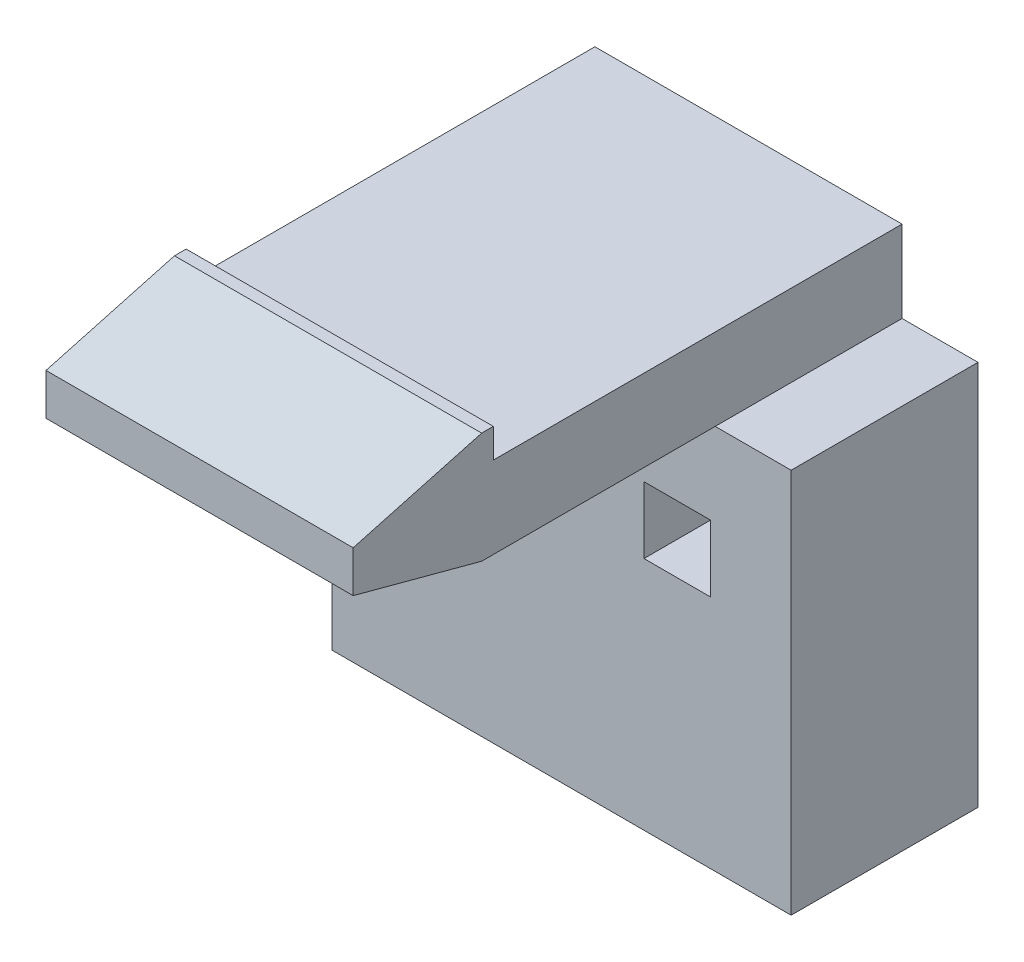
ISO-10303-21;
HEADER;
FILE_DESCRIPTION(('STEP AP214'),'2;1');
FILE_NAME('part.step','',(''),(''),'','','');
FILE_SCHEMA(('AUTOMOTIVE_DESIGN { 1 0 10303 214 1 1 1 1 }'));
ENDSEC;
DATA;
#1=APPLICATION_CONTEXT('core data for automotive mechanical design processes');
#2=APPLICATION_PROTOCOL_DEFINITION('international standard','automotive_design',2000,#1);
#3=PRODUCT_CONTEXT('',#1,'mechanical');
#4=PRODUCT('Part','Part','',(#3));
#5=PRODUCT_RELATED_PRODUCT_CATEGORY('part','',(#4));
#6=PRODUCT_DEFINITION_FORMATION('','',#4);
#7=PRODUCT_DEFINITION_CONTEXT('part definition',#1,'design');
#8=PRODUCT_DEFINITION('design','',#6,#7);
#9=PRODUCT_DEFINITION_SHAPE('','',#8);
#10=(LENGTH_UNIT() NAMED_UNIT(*) SI_UNIT(.MILLI.,.METRE.));
#11=(NAMED_UNIT(*) PLANE_ANGLE_UNIT() SI_UNIT($,.RADIAN.));
#12=(NAMED_UNIT(*) SI_UNIT($,.STERADIAN.) SOLID_ANGLE_UNIT());
#13=UNCERTAINTY_MEASURE_WITH_UNIT(LENGTH_MEASURE(1.E-05),#10,'distance_accuracy_value','');
#14=(GEOMETRIC_REPRESENTATION_CONTEXT(3) GLOBAL_UNCERTAINTY_ASSIGNED_CONTEXT((#13)) GLOBAL_UNIT_ASSIGNED_CONTEXT((#10,
#11,#12)) REPRESENTATION_CONTEXT('',''));
#15=CARTESIAN_POINT('',(0.,0.,0.));
#16=DIRECTION('',(0.,0.,1.));
#17=DIRECTION('',(1.,0.,0.));
#18=AXIS2_PLACEMENT_3D('',#15,#16,#17);
#19=CARTESIAN_POINT('',(0.,0.,9.4));
#20=DIRECTION('',(0.,0.,-1.));
#21=DIRECTION('',(-1.,0.,0.));
#22=AXIS2_PLACEMENT_3D('',#19,#20,#21);
#23=PLANE('',#22);
#24=DIRECTION('',(0.,1.,0.));
#25=VECTOR('',#24,1.);
#26=CARTESIAN_POINT('',(2.63,0.,9.4));
#27=LINE('',#26,#25);
#28=CARTESIAN_POINT('',(2.63,3.65,9.4));
#29=VERTEX_POINT('',#28);
#30=CARTESIAN_POINT('',(2.63,2.93948822334837,9.3999999999999));
#31=VERTEX_POINT('',#30);
#32=EDGE_CURVE('E157',#29,#31,#27,.F.);
#33=ORIENTED_EDGE('',*,*,#32,.F.);
#34=DIRECTION('',(1.,0.,0.));
#35=VECTOR('',#34,1.);
#36=CARTESIAN_POINT('',(0.,3.65,9.4));
#37=LINE('',#36,#35);
#38=CARTESIAN_POINT('',(-2.63,3.65,9.4));
#39=VERTEX_POINT('',#38);
#40=EDGE_CURVE('E162',#29,#39,#37,.F.);
#41=ORIENTED_EDGE('',*,*,#40,.T.);
#42=DIRECTION('',(0.,1.,0.));
#43=VECTOR('',#42,1.);
#44=CARTESIAN_POINT('',(-2.63,0.,9.4));
#45=LINE('',#44,#43);
#46=CARTESIAN_POINT('',(-2.63,2.93948822334837,9.3999999999999));
#47=VERTEX_POINT('',#46);
#48=EDGE_CURVE('E20',#47,#39,#45,.T.);
#49=ORIENTED_EDGE('',*,*,#48,.F.);
#50=DIRECTION('',(1.,0.,0.));
#51=VECTOR('',#50,1.);
#52=CARTESIAN_POINT('',(-3.93,2.9394882233495,9.3999999999996));
#53=LINE('',#52,#51);
#54=EDGE_CURVE('E165',#47,#31,#53,.T.);
#55=ORIENTED_EDGE('',*,*,#54,.T.);
#56=EDGE_LOOP('',(#33,#41,#49,#55));
#57=FACE_BOUND('',#56,.T.);
#58=ADVANCED_FACE('F17',(#57),#23,.F.);
#59=CARTESIAN_POINT('',(-3.93,4.25,9.4));
#60=DIRECTION('',(0.,-1.,0.));
#61=DIRECTION('',(0.,0.,-1.));
#62=AXIS2_PLACEMENT_3D('',#59,#60,#61);
#63=PLANE('',#62);
#64=DIRECTION('',(0.,0.,1.));
#65=VECTOR('',#64,1.);
#66=CARTESIAN_POINT('',(2.63,4.25,0.));
#67=LINE('',#66,#65);
#68=CARTESIAN_POINT('',(2.63,4.24999999999981,7.19999999999995));
#69=VERTEX_POINT('',#68);
#70=CARTESIAN_POINT('',(2.63,4.25,7.));
#71=VERTEX_POINT('',#70);
#72=EDGE_CURVE('E180',#69,#71,#67,.F.);
#73=ORIENTED_EDGE('',*,*,#72,.T.);
#74=DIRECTION('',(-1.,0.,0.));
#75=VECTOR('',#74,1.);
#76=CARTESIAN_POINT('',(0.,4.25,7.));
#77=LINE('',#76,#75);
#78=CARTESIAN_POINT('',(-2.63,4.25,7.));
#79=VERTEX_POINT('',#78);
#80=EDGE_CURVE('E206',#79,#71,#77,.F.);
#81=ORIENTED_EDGE('',*,*,#80,.F.);
#82=DIRECTION('',(0.,0.,-1.));
#83=VECTOR('',#82,1.);
#84=CARTESIAN_POINT('',(-2.63,4.25,9.4));
#85=LINE('',#84,#83);
#86=CARTESIAN_POINT('',(-2.63,4.2499999999999,7.19999999999996));
#87=VERTEX_POINT('',#86);
#88=EDGE_CURVE('E167',#87,#79,#85,.T.);
#89=ORIENTED_EDGE('',*,*,#88,.F.);
#90=DIRECTION('',(1.,0.,0.));
#91=VECTOR('',#90,1.);
#92=CARTESIAN_POINT('',(0.,4.24999999999961,7.1999999999999));
#93=LINE('',#92,#91);
#94=EDGE_CURVE('E176',#87,#69,#93,.T.);
#95=ORIENTED_EDGE('',*,*,#94,.T.);
#96=EDGE_LOOP('',(#73,#81,#89,#95));
#97=FACE_BOUND('',#96,.T.);
#98=ADVANCED_FACE('F207',(#97),#63,.F.);
#99=CARTESIAN_POINT('',(0.,3.65,9.4));
#100=DIRECTION('',(0.,-0.964763821237778,-0.26311740579194));
#101=DIRECTION('',(0.,0.26311740579194,-0.964763821237778));
#102=AXIS2_PLACEMENT_3D('',#99,#100,#101);
#103=PLANE('',#102);
#104=DIRECTION('',(0.,-0.263117405792109,0.964763821237732));
#105=VECTOR('',#104,1.);
#106=CARTESIAN_POINT('',(-2.63,4.25,7.2));
#107=LINE('',#106,#105);
#108=EDGE_CURVE('E175',#87,#39,#107,.T.);
#109=ORIENTED_EDGE('',*,*,#108,.T.);
#110=ORIENTED_EDGE('',*,*,#40,.F.);
#111=DIRECTION('',(0.,0.263117405792109,-0.964763821237732));
#112=VECTOR('',#111,1.);
#113=CARTESIAN_POINT('',(2.63,3.65,9.4));
#114=LINE('',#113,#112);
#115=EDGE_CURVE('E172',#29,#69,#114,.T.);
#116=ORIENTED_EDGE('',*,*,#115,.T.);
#117=ORIENTED_EDGE('',*,*,#94,.F.);
#118=EDGE_LOOP('',(#109,#110,#116,#117));
#119=FACE_BOUND('',#118,.T.);
#120=ADVANCED_FACE('F170',(#119),#103,.F.);
#121=CARTESIAN_POINT('',(-3.93,2.35,7.2));
#122=DIRECTION('',(0.,0.965925826288944,-0.258819045102985));
#123=DIRECTION('',(0.,0.258819045102985,0.965925826288944));
#124=AXIS2_PLACEMENT_3D('',#121,#122,#123);
#125=PLANE('',#124);
#126=DIRECTION('',(0.,-0.258819045102328,-0.96592582628912));
#127=VECTOR('',#126,1.);
#128=CARTESIAN_POINT('',(-2.63,2.939488223348,9.4));
#129=LINE('',#128,#127);
#130=CARTESIAN_POINT('',(-2.63,2.35,7.2));
#131=VERTEX_POINT('',#130);
#132=EDGE_CURVE('E218',#47,#131,#129,.T.);
#133=ORIENTED_EDGE('',*,*,#132,.T.);
#134=DIRECTION('',(1.,0.,0.));
#135=VECTOR('',#134,1.);
#136=CARTESIAN_POINT('',(-3.93,2.35,7.2));
#137=LINE('',#136,#135);
#138=CARTESIAN_POINT('',(2.63,2.35,7.2));
#139=VERTEX_POINT('',#138);
#140=EDGE_CURVE('E185',#131,#139,#137,.T.);
#141=ORIENTED_EDGE('',*,*,#140,.T.);
#142=DIRECTION('',(0.,0.258819045102328,0.96592582628912));
#143=VECTOR('',#142,1.);
#144=CARTESIAN_POINT('',(2.63,2.35,7.2));
#145=LINE('',#144,#143);
#146=EDGE_CURVE('E211',#139,#31,#145,.T.);
#147=ORIENTED_EDGE('',*,*,#146,.T.);
#148=ORIENTED_EDGE('',*,*,#54,.F.);
#149=EDGE_LOOP('',(#133,#141,#147,#148));
#150=FACE_BOUND('',#149,.T.);
#151=ADVANCED_FACE('F261',(#150),#125,.F.);
#152=CARTESIAN_POINT('',(-2.55,-0.22,0.));
#153=DIRECTION('',(0.,-1.,0.));
#154=DIRECTION('',(0.,0.,-1.));
#155=AXIS2_PLACEMENT_3D('',#152,#153,#154);
#156=PLANE('',#155);
#157=DIRECTION('',(1.,0.,0.));
#158=VECTOR('',#157,1.);
#159=CARTESIAN_POINT('',(-2.55,-0.22,0.));
#160=LINE('',#159,#158);
#161=CARTESIAN_POINT('',(-2.55,-0.22,0.));
#162=VERTEX_POINT('',#161);
#163=CARTESIAN_POINT('',(-1.41,-0.22,0.));
#164=VERTEX_POINT('',#163);
#165=EDGE_CURVE('E190',#162,#164,#160,.T.);
#166=ORIENTED_EDGE('',*,*,#165,.F.);
#167=DIRECTION('',(0.,0.,1.));
#168=VECTOR('',#167,1.);
#169=CARTESIAN_POINT('',(-2.55,-0.22,0.));
#170=LINE('',#169,#168);
#171=CARTESIAN_POINT('',(-2.55,-0.22,3.2));
#172=VERTEX_POINT('',#171);
#173=EDGE_CURVE('E274',#162,#172,#170,.T.);
#174=ORIENTED_EDGE('',*,*,#173,.T.);
#175=DIRECTION('',(1.,0.,0.));
#176=VECTOR('',#175,1.);
#177=CARTESIAN_POINT('',(-2.55,-0.22,3.2));
#178=LINE('',#177,#176);
#179=CARTESIAN_POINT('',(-1.41,-0.22,3.2));
#180=VERTEX_POINT('',#179);
#181=EDGE_CURVE('E192',#180,#172,#178,.F.);
#182=ORIENTED_EDGE('',*,*,#181,.F.);
#183=DIRECTION('',(0.,0.,-1.));
#184=VECTOR('',#183,1.);
#185=CARTESIAN_POINT('',(-1.41,-0.22,0.));
#186=LINE('',#185,#184);
#187=EDGE_CURVE('E284',#180,#164,#186,.T.);
#188=ORIENTED_EDGE('',*,*,#187,.T.);
#189=EDGE_LOOP('',(#166,#174,#182,#188));
#190=FACE_BOUND('',#189,.T.);
#191=ADVANCED_FACE('F359',(#190),#156,.F.);
#192=CARTESIAN_POINT('',(-3.93,2.35,3.2));
#193=DIRECTION('',(0.,1.,0.));
#194=DIRECTION('',(0.,0.,1.));
#195=AXIS2_PLACEMENT_3D('',#192,#193,#194);
#196=PLANE('',#195);
#197=DIRECTION('',(0.,0.,-1.));
#198=VECTOR('',#197,1.);
#199=CARTESIAN_POINT('',(-2.63,2.35,0.));
#200=LINE('',#199,#198);
#201=CARTESIAN_POINT('',(-2.63,2.35,3.2));
#202=VERTEX_POINT('',#201);
#203=EDGE_CURVE('E220',#131,#202,#200,.T.);
#204=ORIENTED_EDGE('',*,*,#203,.T.);
#205=DIRECTION('',(-1.,0.,0.));
#206=VECTOR('',#205,1.);
#207=CARTESIAN_POINT('',(0.,2.35,3.2));
#208=LINE('',#207,#206);
#209=CARTESIAN_POINT('',(2.63,2.35,3.2));
#210=VERTEX_POINT('',#209);
#211=EDGE_CURVE('E267',#202,#210,#208,.F.);
#212=ORIENTED_EDGE('',*,*,#211,.T.);
#213=DIRECTION('',(0.,0.,1.));
#214=VECTOR('',#213,1.);
#215=CARTESIAN_POINT('',(2.63,2.35,0.));
#216=LINE('',#215,#214);
#217=EDGE_CURVE('E227',#210,#139,#216,.T.);
#218=ORIENTED_EDGE('',*,*,#217,.T.);
#219=ORIENTED_EDGE('',*,*,#140,.F.);
#220=EDGE_LOOP('',(#204,#212,#218,#219));
#221=FACE_BOUND('',#220,.T.);
#222=ADVANCED_FACE('F265',(#221),#196,.F.);
#223=CARTESIAN_POINT('',(1.41,-0.22,0.));
#224=DIRECTION('',(0.,-1.,0.));
#225=DIRECTION('',(0.,0.,-1.));
#226=AXIS2_PLACEMENT_3D('',#223,#224,#225);
#227=PLANE('',#226);
#228=DIRECTION('',(1.,0.,0.));
#229=VECTOR('',#228,1.);
#230=CARTESIAN_POINT('',(1.41,-0.22,0.));
#231=LINE('',#230,#229);
#232=CARTESIAN_POINT('',(1.41,-0.22,0.));
#233=VERTEX_POINT('',#232);
#234=CARTESIAN_POINT('',(2.55,-0.22,0.));
#235=VERTEX_POINT('',#234);
#236=EDGE_CURVE('E181',#233,#235,#231,.T.);
#237=ORIENTED_EDGE('',*,*,#236,.F.);
#238=DIRECTION('',(0.,0.,1.));
#239=VECTOR('',#238,1.);
#240=CARTESIAN_POINT('',(1.41,-0.22,0.));
#241=LINE('',#240,#239);
#242=CARTESIAN_POINT('',(1.41,-0.22,3.2));
#243=VERTEX_POINT('',#242);
#244=EDGE_CURVE('E327',#233,#243,#241,.T.);
#245=ORIENTED_EDGE('',*,*,#244,.T.);
#246=DIRECTION('',(-1.,0.,0.));
#247=VECTOR('',#246,1.);
#248=CARTESIAN_POINT('',(0.,-0.22,3.2));
#249=LINE('',#248,#247);
#250=CARTESIAN_POINT('',(2.55,-0.22,3.2));
#251=VERTEX_POINT('',#250);
#252=EDGE_CURVE('E341',#243,#251,#249,.F.);
#253=ORIENTED_EDGE('',*,*,#252,.T.);
#254=DIRECTION('',(0.,0.,-1.));
#255=VECTOR('',#254,1.);
#256=CARTESIAN_POINT('',(2.55,-0.22,0.));
#257=LINE('',#256,#255);
#258=EDGE_CURVE('E335',#251,#235,#257,.T.);
#259=ORIENTED_EDGE('',*,*,#258,.T.);
#260=EDGE_LOOP('',(#237,#245,#253,#259));
#261=FACE_BOUND('',#260,.T.);
#262=ADVANCED_FACE('F551',(#261),#227,.F.);
#263=CARTESIAN_POINT('',(2.63,4.25,0.));
#264=DIRECTION('',(-1.,0.,0.));
#265=DIRECTION('',(0.,0.,1.));
#266=AXIS2_PLACEMENT_3D('',#263,#264,#265);
#267=PLANE('',#266);
#268=ORIENTED_EDGE('',*,*,#217,.F.);
#269=DIRECTION('',(0.,0.,-1.));
#270=VECTOR('',#269,1.);
#271=CARTESIAN_POINT('',(2.63,2.35,0.));
#272=LINE('',#271,#270);
#273=CARTESIAN_POINT('',(2.63,2.35,0.));
#274=VERTEX_POINT('',#273);
#275=EDGE_CURVE('E242',#210,#274,#272,.T.);
#276=ORIENTED_EDGE('',*,*,#275,.T.);
#277=DIRECTION('',(0.,1.,0.));
#278=VECTOR('',#277,1.);
#279=CARTESIAN_POINT('',(2.63,4.25,0.));
#280=LINE('',#279,#278);
#281=CARTESIAN_POINT('',(2.63,3.75,0.));
#282=VERTEX_POINT('',#281);
#283=EDGE_CURVE('E183',#282,#274,#280,.F.);
#284=ORIENTED_EDGE('',*,*,#283,.F.);
#285=DIRECTION('',(0.,0.,-1.));
#286=VECTOR('',#285,1.);
#287=CARTESIAN_POINT('',(2.63,3.75,7.));
#288=LINE('',#287,#286);
#289=CARTESIAN_POINT('',(2.63,3.75,7.));
#290=VERTEX_POINT('',#289);
#291=EDGE_CURVE('E325',#282,#290,#288,.F.);
#292=ORIENTED_EDGE('',*,*,#291,.T.);
#293=DIRECTION('',(0.,1.,0.));
#294=VECTOR('',#293,1.);
#295=CARTESIAN_POINT('',(2.63,0.,7.));
#296=LINE('',#295,#294);
#297=EDGE_CURVE('E210',#71,#290,#296,.F.);
#298=ORIENTED_EDGE('',*,*,#297,.F.);
#299=ORIENTED_EDGE('',*,*,#72,.F.);
#300=ORIENTED_EDGE('',*,*,#115,.F.);
#301=ORIENTED_EDGE('',*,*,#32,.T.);
#302=ORIENTED_EDGE('',*,*,#146,.F.);
#303=EDGE_LOOP('',(#268,#276,#284,#292,#298,#299,#300,#301,#302));
#304=FACE_BOUND('',#303,.T.);
#305=ADVANCED_FACE('F178',(#304),#267,.F.);
#306=CARTESIAN_POINT('',(0.,0.,7.));
#307=DIRECTION('',(0.,0.,-1.));
#308=DIRECTION('',(-1.,0.,0.));
#309=AXIS2_PLACEMENT_3D('',#306,#307,#308);
#310=PLANE('',#309);
#311=ORIENTED_EDGE('',*,*,#297,.T.);
#312=DIRECTION('',(1.,0.,0.));
#313=VECTOR('',#312,1.);
#314=CARTESIAN_POINT('',(2.63,3.75,7.));
#315=LINE('',#314,#313);
#316=CARTESIAN_POINT('',(-2.63,3.75,7.));
#317=VERTEX_POINT('',#316);
#318=EDGE_CURVE('E215',#290,#317,#315,.F.);
#319=ORIENTED_EDGE('',*,*,#318,.T.);
#320=DIRECTION('',(0.,1.,0.));
#321=VECTOR('',#320,1.);
#322=CARTESIAN_POINT('',(-2.63,4.25,7.));
#323=LINE('',#322,#321);
#324=EDGE_CURVE('E202',#317,#79,#323,.T.);
#325=ORIENTED_EDGE('',*,*,#324,.T.);
#326=ORIENTED_EDGE('',*,*,#80,.T.);
#327=EDGE_LOOP('',(#311,#319,#325,#326));
#328=FACE_BOUND('',#327,.T.);
#329=ADVANCED_FACE('F213',(#328),#310,.T.);
#330=CARTESIAN_POINT('',(-2.63,4.25,0.));
#331=DIRECTION('',(1.,0.,0.));
#332=DIRECTION('',(0.,0.,-1.));
#333=AXIS2_PLACEMENT_3D('',#330,#331,#332);
#334=PLANE('',#333);
#335=ORIENTED_EDGE('',*,*,#48,.T.);
#336=ORIENTED_EDGE('',*,*,#108,.F.);
#337=ORIENTED_EDGE('',*,*,#88,.T.);
#338=ORIENTED_EDGE('',*,*,#324,.F.);
#339=DIRECTION('',(0.,0.,-1.));
#340=VECTOR('',#339,1.);
#341=CARTESIAN_POINT('',(-2.63,3.75,7.));
#342=LINE('',#341,#340);
#343=CARTESIAN_POINT('',(-2.63,3.75,0.));
#344=VERTEX_POINT('',#343);
#345=EDGE_CURVE('E322',#317,#344,#342,.T.);
#346=ORIENTED_EDGE('',*,*,#345,.T.);
#347=DIRECTION('',(0.,1.,0.));
#348=VECTOR('',#347,1.);
#349=CARTESIAN_POINT('',(-2.63,4.25,0.));
#350=LINE('',#349,#348);
#351=CARTESIAN_POINT('',(-2.63,2.35,0.));
#352=VERTEX_POINT('',#351);
#353=EDGE_CURVE('E216',#352,#344,#350,.T.);
#354=ORIENTED_EDGE('',*,*,#353,.F.);
#355=DIRECTION('',(0.,0.,-1.));
#356=VECTOR('',#355,1.);
#357=CARTESIAN_POINT('',(-2.63,2.35,0.));
#358=LINE('',#357,#356);
#359=EDGE_CURVE('E251',#352,#202,#358,.F.);
#360=ORIENTED_EDGE('',*,*,#359,.T.);
#361=ORIENTED_EDGE('',*,*,#203,.F.);
#362=ORIENTED_EDGE('',*,*,#132,.F.);
#363=EDGE_LOOP('',(#335,#336,#337,#338,#346,#354,#360,#361,#362));
#364=FACE_BOUND('',#363,.T.);
#365=ADVANCED_FACE('F199',(#364),#334,.F.);
#366=CARTESIAN_POINT('',(3.93,2.35,0.));
#367=DIRECTION('',(0.,-1.,0.));
#368=DIRECTION('',(0.,0.,-1.));
#369=AXIS2_PLACEMENT_3D('',#366,#367,#368);
#370=PLANE('',#369);
#371=ORIENTED_EDGE('',*,*,#275,.F.);
#372=DIRECTION('',(-1.,0.,0.));
#373=VECTOR('',#372,1.);
#374=CARTESIAN_POINT('',(0.,2.35,3.2));
#375=LINE('',#374,#373);
#376=CARTESIAN_POINT('',(3.93,2.35,3.2));
#377=VERTEX_POINT('',#376);
#378=EDGE_CURVE('E269',#210,#377,#375,.F.);
#379=ORIENTED_EDGE('',*,*,#378,.T.);
#380=DIRECTION('',(0.,0.,1.));
#381=VECTOR('',#380,1.);
#382=CARTESIAN_POINT('',(3.93,2.35,9.4));
#383=LINE('',#382,#381);
#384=CARTESIAN_POINT('',(3.93,2.35,0.));
#385=VERTEX_POINT('',#384);
#386=EDGE_CURVE('E249',#377,#385,#383,.F.);
#387=ORIENTED_EDGE('',*,*,#386,.T.);
#388=DIRECTION('',(1.,0.,0.));
#389=VECTOR('',#388,1.);
#390=CARTESIAN_POINT('',(3.93,2.35,0.));
#391=LINE('',#390,#389);
#392=EDGE_CURVE('E236',#274,#385,#391,.T.);
#393=ORIENTED_EDGE('',*,*,#392,.F.);
#394=EDGE_LOOP('',(#371,#379,#387,#393));
#395=FACE_BOUND('',#394,.T.);
#396=ADVANCED_FACE('F247',(#395),#370,.F.);
#397=CARTESIAN_POINT('',(-3.93,2.35,0.));
#398=DIRECTION('',(0.,-1.,0.));
#399=DIRECTION('',(0.,0.,-1.));
#400=AXIS2_PLACEMENT_3D('',#397,#398,#399);
#401=PLANE('',#400);
#402=DIRECTION('',(0.,0.,-1.));
#403=VECTOR('',#402,1.);
#404=CARTESIAN_POINT('',(-3.93,2.35,9.4));
#405=LINE('',#404,#403);
#406=CARTESIAN_POINT('',(-3.93,2.35,0.));
#407=VERTEX_POINT('',#406);
#408=CARTESIAN_POINT('',(-3.93,2.35,3.2));
#409=VERTEX_POINT('',#408);
#410=EDGE_CURVE('E294',#407,#409,#405,.F.);
#411=ORIENTED_EDGE('',*,*,#410,.T.);
#412=DIRECTION('',(-1.,0.,0.));
#413=VECTOR('',#412,1.);
#414=CARTESIAN_POINT('',(0.,2.35,3.2));
#415=LINE('',#414,#413);
#416=EDGE_CURVE('E270',#409,#202,#415,.F.);
#417=ORIENTED_EDGE('',*,*,#416,.T.);
#418=ORIENTED_EDGE('',*,*,#359,.F.);
#419=DIRECTION('',(1.,0.,0.));
#420=VECTOR('',#419,1.);
#421=CARTESIAN_POINT('',(-3.93,2.35,0.));
#422=LINE('',#421,#420);
#423=EDGE_CURVE('E254',#407,#352,#422,.T.);
#424=ORIENTED_EDGE('',*,*,#423,.F.);
#425=EDGE_LOOP('',(#411,#417,#418,#424));
#426=FACE_BOUND('',#425,.T.);
#427=ADVANCED_FACE('F293',(#426),#401,.F.);
#428=CARTESIAN_POINT('',(-1.41,-0.22,0.));
#429=DIRECTION('',(1.,0.,0.));
#430=DIRECTION('',(0.,0.,-1.));
#431=AXIS2_PLACEMENT_3D('',#428,#429,#430);
#432=PLANE('',#431);
#433=DIRECTION('',(0.,1.,0.));
#434=VECTOR('',#433,1.);
#435=CARTESIAN_POINT('',(-1.41,-0.22,0.));
#436=LINE('',#435,#434);
#437=CARTESIAN_POINT('',(-1.41,0.92,0.));
#438=VERTEX_POINT('',#437);
#439=EDGE_CURVE('E282',#164,#438,#436,.T.);
#440=ORIENTED_EDGE('',*,*,#439,.F.);
#441=ORIENTED_EDGE('',*,*,#187,.F.);
#442=DIRECTION('',(0.,1.,0.));
#443=VECTOR('',#442,1.);
#444=CARTESIAN_POINT('',(-1.41,0.,3.2));
#445=LINE('',#444,#443);
#446=CARTESIAN_POINT('',(-1.41,0.92,3.2));
#447=VERTEX_POINT('',#446);
#448=EDGE_CURVE('E343',#180,#447,#445,.T.);
#449=ORIENTED_EDGE('',*,*,#448,.T.);
#450=DIRECTION('',(0.,0.,1.));
#451=VECTOR('',#450,1.);
#452=CARTESIAN_POINT('',(-1.41,0.92,0.));
#453=LINE('',#452,#451);
#454=EDGE_CURVE('E368',#447,#438,#453,.F.);
#455=ORIENTED_EDGE('',*,*,#454,.T.);
#456=EDGE_LOOP('',(#440,#441,#449,#455));
#457=FACE_BOUND('',#456,.T.);
#458=ADVANCED_FACE('F501',(#457),#432,.F.);
#459=CARTESIAN_POINT('',(-2.55,-0.22,0.));
#460=DIRECTION('',(-1.,0.,0.));
#461=DIRECTION('',(0.,0.,1.));
#462=AXIS2_PLACEMENT_3D('',#459,#460,#461);
#463=PLANE('',#462);
#464=DIRECTION('',(0.,1.,0.));
#465=VECTOR('',#464,1.);
#466=CARTESIAN_POINT('',(-2.55,-0.22,0.));
#467=LINE('',#466,#465);
#468=CARTESIAN_POINT('',(-2.55,0.92,0.));
#469=VERTEX_POINT('',#468);
#470=EDGE_CURVE('E280',#469,#162,#467,.F.);
#471=ORIENTED_EDGE('',*,*,#470,.F.);
#472=DIRECTION('',(0.,0.,1.));
#473=VECTOR('',#472,1.);
#474=CARTESIAN_POINT('',(-2.55,0.92,0.));
#475=LINE('',#474,#473);
#476=CARTESIAN_POINT('',(-2.55,0.92,3.2));
#477=VERTEX_POINT('',#476);
#478=EDGE_CURVE('E350',#469,#477,#475,.T.);
#479=ORIENTED_EDGE('',*,*,#478,.T.);
#480=DIRECTION('',(0.,1.,0.));
#481=VECTOR('',#480,1.);
#482=CARTESIAN_POINT('',(-2.55,0.,3.2));
#483=LINE('',#482,#481);
#484=EDGE_CURVE('E272',#477,#172,#483,.F.);
#485=ORIENTED_EDGE('',*,*,#484,.T.);
#486=ORIENTED_EDGE('',*,*,#173,.F.);
#487=EDGE_LOOP('',(#471,#479,#485,#486));
#488=FACE_BOUND('',#487,.T.);
#489=ADVANCED_FACE('F348',(#488),#463,.F.);
#490=CARTESIAN_POINT('',(0.,0.,3.2));
#491=DIRECTION('',(0.,0.,-1.));
#492=DIRECTION('',(-1.,0.,0.));
#493=AXIS2_PLACEMENT_3D('',#490,#491,#492);
#494=PLANE('',#493);
#495=ORIENTED_EDGE('',*,*,#252,.F.);
#496=DIRECTION('',(0.,1.,0.));
#497=VECTOR('',#496,1.);
#498=CARTESIAN_POINT('',(1.41,-0.22,3.2));
#499=LINE('',#498,#497);
#500=CARTESIAN_POINT('',(1.41,0.92,3.2));
#501=VERTEX_POINT('',#500);
#502=EDGE_CURVE('E332',#243,#501,#499,.T.);
#503=ORIENTED_EDGE('',*,*,#502,.T.);
#504=DIRECTION('',(1.,0.,0.));
#505=VECTOR('',#504,1.);
#506=CARTESIAN_POINT('',(1.41,0.92,3.2));
#507=LINE('',#506,#505);
#508=CARTESIAN_POINT('',(2.55,0.92,3.2));
#509=VERTEX_POINT('',#508);
#510=EDGE_CURVE('E367',#501,#509,#507,.T.);
#511=ORIENTED_EDGE('',*,*,#510,.T.);
#512=DIRECTION('',(0.,1.,0.));
#513=VECTOR('',#512,1.);
#514=CARTESIAN_POINT('',(2.55,-0.22,3.2));
#515=LINE('',#514,#513);
#516=EDGE_CURVE('E338',#509,#251,#515,.F.);
#517=ORIENTED_EDGE('',*,*,#516,.T.);
#518=EDGE_LOOP('',(#495,#503,#511,#517));
#519=FACE_BOUND('',#518,.T.);
#520=ORIENTED_EDGE('',*,*,#181,.T.);
#521=ORIENTED_EDGE('',*,*,#484,.F.);
#522=DIRECTION('',(1.,0.,0.));
#523=VECTOR('',#522,1.);
#524=CARTESIAN_POINT('',(-2.55,0.92,3.2));
#525=LINE('',#524,#523);
#526=EDGE_CURVE('E314',#477,#447,#525,.T.);
#527=ORIENTED_EDGE('',*,*,#526,.T.);
#528=ORIENTED_EDGE('',*,*,#448,.F.);
#529=EDGE_LOOP('',(#520,#521,#527,#528));
#530=FACE_BOUND('',#529,.T.);
#531=DIRECTION('',(0.,1.,0.));
#532=VECTOR('',#531,1.);
#533=CARTESIAN_POINT('',(3.93,-4.25,3.2));
#534=LINE('',#533,#532);
#535=CARTESIAN_POINT('',(3.93,-4.25,3.2));
#536=VERTEX_POINT('',#535);
#537=EDGE_CURVE('E320',#536,#377,#534,.T.);
#538=ORIENTED_EDGE('',*,*,#537,.T.);
#539=ORIENTED_EDGE('',*,*,#378,.F.);
#540=ORIENTED_EDGE('',*,*,#211,.F.);
#541=ORIENTED_EDGE('',*,*,#416,.F.);
#542=DIRECTION('',(0.,1.,0.));
#543=VECTOR('',#542,1.);
#544=CARTESIAN_POINT('',(-3.93,-4.25,3.2));
#545=LINE('',#544,#543);
#546=CARTESIAN_POINT('',(-3.93,-4.25,3.2));
#547=VERTEX_POINT('',#546);
#548=EDGE_CURVE('E299',#409,#547,#545,.F.);
#549=ORIENTED_EDGE('',*,*,#548,.T.);
#550=DIRECTION('',(1.,0.,0.));
#551=VECTOR('',#550,1.);
#552=CARTESIAN_POINT('',(-3.93,-4.25,3.2));
#553=LINE('',#552,#551);
#554=EDGE_CURVE('E301',#547,#536,#553,.T.);
#555=ORIENTED_EDGE('',*,*,#554,.T.);
#556=EDGE_LOOP('',(#538,#539,#540,#541,#549,#555));
#557=FACE_BOUND('',#556,.T.);
#558=ADVANCED_FACE('F297',(#519,#530,#557),#494,.F.);
#559=CARTESIAN_POINT('',(2.55,-0.22,0.));
#560=DIRECTION('',(1.,0.,0.));
#561=DIRECTION('',(0.,0.,-1.));
#562=AXIS2_PLACEMENT_3D('',#559,#560,#561);
#563=PLANE('',#562);
#564=DIRECTION('',(0.,1.,0.));
#565=VECTOR('',#564,1.);
#566=CARTESIAN_POINT('',(2.55,-0.22,0.));
#567=LINE('',#566,#565);
#568=CARTESIAN_POINT('',(2.55,0.92,0.));
#569=VERTEX_POINT('',#568);
#570=EDGE_CURVE('E34',#235,#569,#567,.T.);
#571=ORIENTED_EDGE('',*,*,#570,.F.);
#572=ORIENTED_EDGE('',*,*,#258,.F.);
#573=ORIENTED_EDGE('',*,*,#516,.F.);
#574=DIRECTION('',(0.,0.,1.));
#575=VECTOR('',#574,1.);
#576=CARTESIAN_POINT('',(2.55,0.92,0.));
#577=LINE('',#576,#575);
#578=EDGE_CURVE('E370',#509,#569,#577,.F.);
#579=ORIENTED_EDGE('',*,*,#578,.T.);
#580=EDGE_LOOP('',(#571,#572,#573,#579));
#581=FACE_BOUND('',#580,.T.);
#582=ADVANCED_FACE('F473',(#581),#563,.F.);
#583=CARTESIAN_POINT('',(1.41,-0.22,0.));
#584=DIRECTION('',(-1.,0.,0.));
#585=DIRECTION('',(0.,0.,1.));
#586=AXIS2_PLACEMENT_3D('',#583,#584,#585);
#587=PLANE('',#586);
#588=DIRECTION('',(0.,1.,0.));
#589=VECTOR('',#588,1.);
#590=CARTESIAN_POINT('',(1.41,-0.22,0.));
#591=LINE('',#590,#589);
#592=CARTESIAN_POINT('',(1.41,0.92,0.));
#593=VERTEX_POINT('',#592);
#594=EDGE_CURVE('E330',#593,#233,#591,.F.);
#595=ORIENTED_EDGE('',*,*,#594,.F.);
#596=DIRECTION('',(0.,0.,1.));
#597=VECTOR('',#596,1.);
#598=CARTESIAN_POINT('',(1.41,0.92,0.));
#599=LINE('',#598,#597);
#600=EDGE_CURVE('E375',#593,#501,#599,.T.);
#601=ORIENTED_EDGE('',*,*,#600,.T.);
#602=ORIENTED_EDGE('',*,*,#502,.F.);
#603=ORIENTED_EDGE('',*,*,#244,.F.);
#604=EDGE_LOOP('',(#595,#601,#602,#603));
#605=FACE_BOUND('',#604,.T.);
#606=ADVANCED_FACE('F395',(#605),#587,.F.);
#607=CARTESIAN_POINT('',(2.63,3.75,7.));
#608=DIRECTION('',(0.,-1.,0.));
#609=DIRECTION('',(0.,0.,-1.));
#610=AXIS2_PLACEMENT_3D('',#607,#608,#609);
#611=PLANE('',#610);
#612=ORIENTED_EDGE('',*,*,#318,.F.);
#613=ORIENTED_EDGE('',*,*,#291,.F.);
#614=DIRECTION('',(-1.,0.,0.));
#615=VECTOR('',#614,1.);
#616=CARTESIAN_POINT('',(0.,3.75,0.));
#617=LINE('',#616,#615);
#618=EDGE_CURVE('E239',#344,#282,#617,.F.);
#619=ORIENTED_EDGE('',*,*,#618,.F.);
#620=ORIENTED_EDGE('',*,*,#345,.F.);
#621=EDGE_LOOP('',(#612,#613,#619,#620));
#622=FACE_BOUND('',#621,.T.);
#623=ADVANCED_FACE('F387',(#622),#611,.F.);
#624=CARTESIAN_POINT('',(3.93,-4.25,9.4));
#625=DIRECTION('',(-1.,0.,0.));
#626=DIRECTION('',(0.,0.,1.));
#627=AXIS2_PLACEMENT_3D('',#624,#625,#626);
#628=PLANE('',#627);
#629=ORIENTED_EDGE('',*,*,#537,.F.);
#630=DIRECTION('',(0.,0.,1.));
#631=VECTOR('',#630,1.);
#632=CARTESIAN_POINT('',(3.93,-4.25,9.4));
#633=LINE('',#632,#631);
#634=CARTESIAN_POINT('',(3.93,-4.25,0.));
#635=VERTEX_POINT('',#634);
#636=EDGE_CURVE('E310',#536,#635,#633,.F.);
#637=ORIENTED_EDGE('',*,*,#636,.T.);
#638=DIRECTION('',(0.,1.,0.));
#639=VECTOR('',#638,1.);
#640=CARTESIAN_POINT('',(3.93,0.,0.));
#641=LINE('',#640,#639);
#642=EDGE_CURVE('E379',#385,#635,#641,.F.);
#643=ORIENTED_EDGE('',*,*,#642,.F.);
#644=ORIENTED_EDGE('',*,*,#386,.F.);
#645=EDGE_LOOP('',(#629,#637,#643,#644));
#646=FACE_BOUND('',#645,.T.);
#647=ADVANCED_FACE('F385',(#646),#628,.F.);
#648=CARTESIAN_POINT('',(-3.93,-4.25,9.4));
#649=DIRECTION('',(0.,1.,0.));
#650=DIRECTION('',(0.,0.,1.));
#651=AXIS2_PLACEMENT_3D('',#648,#649,#650);
#652=PLANE('',#651);
#653=DIRECTION('',(0.,0.,-1.));
#654=VECTOR('',#653,1.);
#655=CARTESIAN_POINT('',(-3.93,-4.25,9.4));
#656=LINE('',#655,#654);
#657=CARTESIAN_POINT('',(-3.93,-4.25,0.));
#658=VERTEX_POINT('',#657);
#659=EDGE_CURVE('E305',#547,#658,#656,.T.);
#660=ORIENTED_EDGE('',*,*,#659,.T.);
#661=DIRECTION('',(-1.,0.,0.));
#662=VECTOR('',#661,1.);
#663=CARTESIAN_POINT('',(0.,-4.25,0.));
#664=LINE('',#663,#662);
#665=EDGE_CURVE('E381',#635,#658,#664,.T.);
#666=ORIENTED_EDGE('',*,*,#665,.F.);
#667=ORIENTED_EDGE('',*,*,#636,.F.);
#668=ORIENTED_EDGE('',*,*,#554,.F.);
#669=EDGE_LOOP('',(#660,#666,#667,#668));
#670=FACE_BOUND('',#669,.T.);
#671=ADVANCED_FACE('F308',(#670),#652,.F.);
#672=CARTESIAN_POINT('',(-3.93,-4.25,9.4));
#673=DIRECTION('',(1.,0.,0.));
#674=DIRECTION('',(0.,0.,-1.));
#675=AXIS2_PLACEMENT_3D('',#672,#673,#674);
#676=PLANE('',#675);
#677=DIRECTION('',(0.,1.,0.));
#678=VECTOR('',#677,1.);
#679=CARTESIAN_POINT('',(-3.93,0.,0.));
#680=LINE('',#679,#678);
#681=EDGE_CURVE('E289',#658,#407,#680,.T.);
#682=ORIENTED_EDGE('',*,*,#681,.F.);
#683=ORIENTED_EDGE('',*,*,#659,.F.);
#684=ORIENTED_EDGE('',*,*,#548,.F.);
#685=ORIENTED_EDGE('',*,*,#410,.F.);
#686=EDGE_LOOP('',(#682,#683,#684,#685));
#687=FACE_BOUND('',#686,.T.);
#688=ADVANCED_FACE('F312',(#687),#676,.F.);
#689=CARTESIAN_POINT('',(-2.55,0.92,0.));
#690=DIRECTION('',(0.,1.,0.));
#691=DIRECTION('',(0.,0.,1.));
#692=AXIS2_PLACEMENT_3D('',#689,#690,#691);
#693=PLANE('',#692);
#694=DIRECTION('',(-1.,0.,0.));
#695=VECTOR('',#694,1.);
#696=CARTESIAN_POINT('',(0.,0.92,0.));
#697=LINE('',#696,#695);
#698=EDGE_CURVE('E26',#438,#469,#697,.T.);
#699=ORIENTED_EDGE('',*,*,#698,.F.);
#700=ORIENTED_EDGE('',*,*,#454,.F.);
#701=ORIENTED_EDGE('',*,*,#526,.F.);
#702=ORIENTED_EDGE('',*,*,#478,.F.);
#703=EDGE_LOOP('',(#699,#700,#701,#702));
#704=FACE_BOUND('',#703,.T.);
#705=ADVANCED_FACE('F366',(#704),#693,.F.);
#706=CARTESIAN_POINT('',(1.41,0.92,0.));
#707=DIRECTION('',(0.,1.,0.));
#708=DIRECTION('',(0.,0.,1.));
#709=AXIS2_PLACEMENT_3D('',#706,#707,#708);
#710=PLANE('',#709);
#711=DIRECTION('',(-1.,0.,0.));
#712=VECTOR('',#711,1.);
#713=CARTESIAN_POINT('',(0.,0.92,0.));
#714=LINE('',#713,#712);
#715=EDGE_CURVE('E11',#569,#593,#714,.T.);
#716=ORIENTED_EDGE('',*,*,#715,.F.);
#717=ORIENTED_EDGE('',*,*,#578,.F.);
#718=ORIENTED_EDGE('',*,*,#510,.F.);
#719=ORIENTED_EDGE('',*,*,#600,.F.);
#720=EDGE_LOOP('',(#716,#717,#718,#719));
#721=FACE_BOUND('',#720,.T.);
#722=ADVANCED_FACE('F399',(#721),#710,.F.);
#723=CARTESIAN_POINT('',(0.,0.,0.));
#724=DIRECTION('',(0.,0.,-1.));
#725=DIRECTION('',(-1.,0.,0.));
#726=AXIS2_PLACEMENT_3D('',#723,#724,#725);
#727=PLANE('',#726);
#728=ORIENTED_EDGE('',*,*,#570,.T.);
#729=ORIENTED_EDGE('',*,*,#715,.T.);
#730=ORIENTED_EDGE('',*,*,#594,.T.);
#731=ORIENTED_EDGE('',*,*,#236,.T.);
#732=EDGE_LOOP('',(#728,#729,#730,#731));
#733=FACE_BOUND('',#732,.T.);
#734=ORIENTED_EDGE('',*,*,#439,.T.);
#735=ORIENTED_EDGE('',*,*,#698,.T.);
#736=ORIENTED_EDGE('',*,*,#470,.T.);
#737=ORIENTED_EDGE('',*,*,#165,.T.);
#738=EDGE_LOOP('',(#734,#735,#736,#737));
#739=FACE_BOUND('',#738,.T.);
#740=ORIENTED_EDGE('',*,*,#665,.T.);
#741=ORIENTED_EDGE('',*,*,#681,.T.);
#742=ORIENTED_EDGE('',*,*,#423,.T.);
#743=ORIENTED_EDGE('',*,*,#353,.T.);
#744=ORIENTED_EDGE('',*,*,#618,.T.);
#745=ORIENTED_EDGE('',*,*,#283,.T.);
#746=ORIENTED_EDGE('',*,*,#392,.T.);
#747=ORIENTED_EDGE('',*,*,#642,.T.);
#748=EDGE_LOOP('',(#740,#741,#742,#743,#744,#745,#746,#747));
#749=FACE_BOUND('',#748,.T.);
#750=ADVANCED_FACE('F233',(#733,#739,#749),#727,.T.);
#751=CLOSED_SHELL('',(#58,#98,#120,#151,#191,#222,#262,#305,#329,#365,#396,#427,#458,#489,#558,
#582,#606,#623,#647,#671,#688,#705,#722,#750));
#752=MANIFOLD_SOLID_BREP('B1',#751);
#753=ADVANCED_BREP_SHAPE_REPRESENTATION('',(#18,#752),#14);
#754=SHAPE_DEFINITION_REPRESENTATION(#9,#753);
ENDSEC;
END-ISO-10303-21;
